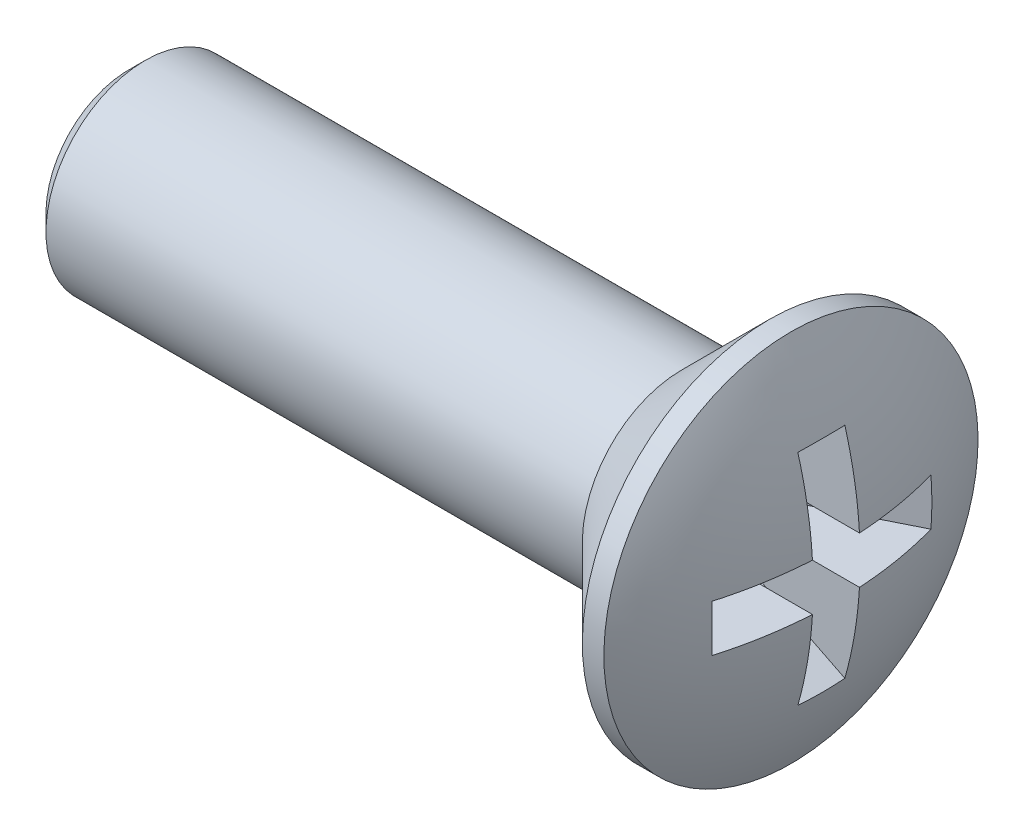
ISO-10303-21;
HEADER;
FILE_DESCRIPTION(('STEP AP214'),'2;1');
FILE_NAME('part.step','',(''),(''),'','','');
FILE_SCHEMA(('AUTOMOTIVE_DESIGN { 1 0 10303 214 1 1 1 1 }'));
ENDSEC;
DATA;
#1=APPLICATION_CONTEXT('core data for automotive mechanical design processes');
#2=APPLICATION_PROTOCOL_DEFINITION('international standard','automotive_design',2000,#1);
#3=PRODUCT_CONTEXT('',#1,'mechanical');
#4=PRODUCT('Part','Part','',(#3));
#5=PRODUCT_RELATED_PRODUCT_CATEGORY('part','',(#4));
#6=PRODUCT_DEFINITION_FORMATION('','',#4);
#7=PRODUCT_DEFINITION_CONTEXT('part definition',#1,'design');
#8=PRODUCT_DEFINITION('design','',#6,#7);
#9=PRODUCT_DEFINITION_SHAPE('','',#8);
#10=(LENGTH_UNIT() NAMED_UNIT(*) SI_UNIT(.MILLI.,.METRE.));
#11=(NAMED_UNIT(*) PLANE_ANGLE_UNIT() SI_UNIT($,.RADIAN.));
#12=(NAMED_UNIT(*) SI_UNIT($,.STERADIAN.) SOLID_ANGLE_UNIT());
#13=UNCERTAINTY_MEASURE_WITH_UNIT(LENGTH_MEASURE(1.E-05),#10,'distance_accuracy_value','');
#14=(GEOMETRIC_REPRESENTATION_CONTEXT(3) GLOBAL_UNCERTAINTY_ASSIGNED_CONTEXT((#13)) GLOBAL_UNIT_ASSIGNED_CONTEXT((#10,
#11,#12)) REPRESENTATION_CONTEXT('',''));
#15=CARTESIAN_POINT('',(0.,0.,0.));
#16=DIRECTION('',(0.,0.,1.));
#17=DIRECTION('',(1.,0.,0.));
#18=AXIS2_PLACEMENT_3D('',#15,#16,#17);
#19=CARTESIAN_POINT('',(-12.1008928571429,0.,0.));
#20=DIRECTION('',(1.,0.,0.));
#21=DIRECTION('',(0.,-1.,0.));
#22=AXIS2_PLACEMENT_3D('',#19,#20,#21);
#23=SPHERICAL_SURFACE('',#22,12.1008928571429);
#24=CARTESIAN_POINT('',(-1.4,0.,0.));
#25=DIRECTION('',(1.,0.,0.));
#26=DIRECTION('',(0.,1.,0.));
#27=AXIS2_PLACEMENT_3D('',#24,#25,#26);
#28=CIRCLE('',#27,5.65);
#29=CARTESIAN_POINT('',(-1.4,5.65,0.));
#30=VERTEX_POINT('',#29);
#31=EDGE_CURVE('E273',#30,#30,#28,.T.);
#32=ORIENTED_EDGE('',*,*,#31,.T.);
#33=EDGE_LOOP('',(#32));
#34=FACE_BOUND('',#33,.T.);
#35=CARTESIAN_POINT('',(-12.1008928571429,0.71,0.));
#36=DIRECTION('',(0.,-1.,0.));
#37=DIRECTION('',(0.,0.,-1.));
#38=AXIS2_PLACEMENT_3D('',#35,#36,#37);
#39=CIRCLE('',#38,12.0800458583588);
#40=CARTESIAN_POINT('',(-0.482948462369839,0.71,3.30921077902471));
#41=VERTEX_POINT('',#40);
#42=CARTESIAN_POINT('',(-0.0417300362812456,0.71,0.71));
#43=VERTEX_POINT('',#42);
#44=EDGE_CURVE('E200',#41,#43,#39,.F.);
#45=ORIENTED_EDGE('',*,*,#44,.T.);
#46=CARTESIAN_POINT('',(-12.1008928571429,0.,0.71));
#47=DIRECTION('',(0.,0.,-1.));
#48=DIRECTION('',(-1.,0.,0.));
#49=AXIS2_PLACEMENT_3D('',#46,#47,#48);
#50=CIRCLE('',#49,12.0800458583588);
#51=CARTESIAN_POINT('',(-0.482948462369839,3.30921077902471,0.71));
#52=VERTEX_POINT('',#51);
#53=EDGE_CURVE('E163',#43,#52,#50,.F.);
#54=ORIENTED_EDGE('',*,*,#53,.T.);
#55=CARTESIAN_POINT('',(-11.1092740163963,-1.98887970340109,0.));
#56=DIRECTION('',(0.44619781310981,-0.894934361602025,0.));
#57=DIRECTION('',(0.894934361602025,0.44619781310981,0.));
#58=AXIS2_PLACEMENT_3D('',#55,#56,#57);
#59=CIRCLE('',#58,11.8950686227582);
#60=CARTESIAN_POINT('',(-0.482948462369839,3.30921077902471,-0.71));
#61=VERTEX_POINT('',#60);
#62=EDGE_CURVE('E162',#52,#61,#59,.F.);
#63=ORIENTED_EDGE('',*,*,#62,.T.);
#64=CARTESIAN_POINT('',(-12.1008928571429,0.,-0.71));
#65=DIRECTION('',(0.,0.,-1.));
#66=DIRECTION('',(-1.,0.,0.));
#67=AXIS2_PLACEMENT_3D('',#64,#65,#66);
#68=CIRCLE('',#67,12.0800458583588);
#69=CARTESIAN_POINT('',(-0.0417300362812456,0.71,-0.71));
#70=VERTEX_POINT('',#69);
#71=EDGE_CURVE('E160',#70,#61,#68,.F.);
#72=ORIENTED_EDGE('',*,*,#71,.F.);
#73=CARTESIAN_POINT('',(-12.1008928571429,0.71,0.));
#74=DIRECTION('',(0.,-1.,0.));
#75=DIRECTION('',(0.,0.,-1.));
#76=AXIS2_PLACEMENT_3D('',#73,#74,#75);
#77=CIRCLE('',#76,12.0800458583588);
#78=CARTESIAN_POINT('',(-0.482948462369839,0.71,-3.30921077902471));
#79=VERTEX_POINT('',#78);
#80=EDGE_CURVE('E155',#70,#79,#77,.F.);
#81=ORIENTED_EDGE('',*,*,#80,.T.);
#82=CARTESIAN_POINT('',(-11.1092740163963,0.,1.98887970340109));
#83=DIRECTION('',(0.44619781310981,0.,0.894934361602025));
#84=DIRECTION('',(0.894934361602025,0.,-0.44619781310981));
#85=AXIS2_PLACEMENT_3D('',#82,#83,#84);
#86=CIRCLE('',#85,11.8950686227582);
#87=CARTESIAN_POINT('',(-0.482948462369839,-0.71,-3.30921077902471));
#88=VERTEX_POINT('',#87);
#89=EDGE_CURVE('E153',#79,#88,#86,.F.);
#90=ORIENTED_EDGE('',*,*,#89,.T.);
#91=CARTESIAN_POINT('',(-12.1008928571429,-0.71,0.));
#92=DIRECTION('',(0.,-1.,0.));
#93=DIRECTION('',(0.,0.,-1.));
#94=AXIS2_PLACEMENT_3D('',#91,#92,#93);
#95=CIRCLE('',#94,12.0800458583588);
#96=CARTESIAN_POINT('',(-0.0417300362812456,-0.71,-0.71));
#97=VERTEX_POINT('',#96);
#98=EDGE_CURVE('E138',#97,#88,#95,.F.);
#99=ORIENTED_EDGE('',*,*,#98,.F.);
#100=CARTESIAN_POINT('',(-12.1008928571429,0.,-0.71));
#101=DIRECTION('',(0.,0.,-1.));
#102=DIRECTION('',(-1.,0.,0.));
#103=AXIS2_PLACEMENT_3D('',#100,#101,#102);
#104=CIRCLE('',#103,12.0800458583588);
#105=CARTESIAN_POINT('',(-0.482948462369839,-3.30921077902471,-0.71));
#106=VERTEX_POINT('',#105);
#107=EDGE_CURVE('E128',#106,#97,#104,.F.);
#108=ORIENTED_EDGE('',*,*,#107,.F.);
#109=CARTESIAN_POINT('',(-11.1092740163963,1.98887970340109,0.));
#110=DIRECTION('',(0.44619781310981,0.894934361602025,0.));
#111=DIRECTION('',(-0.894934361602025,0.44619781310981,0.));
#112=AXIS2_PLACEMENT_3D('',#109,#110,#111);
#113=CIRCLE('',#112,11.8950686227582);
#114=CARTESIAN_POINT('',(-0.482948462369839,-3.30921077902471,0.71));
#115=VERTEX_POINT('',#114);
#116=EDGE_CURVE('E139',#115,#106,#113,.T.);
#117=ORIENTED_EDGE('',*,*,#116,.F.);
#118=CARTESIAN_POINT('',(-12.1008928571429,0.,0.71));
#119=DIRECTION('',(0.,0.,-1.));
#120=DIRECTION('',(-1.,0.,0.));
#121=AXIS2_PLACEMENT_3D('',#118,#119,#120);
#122=CIRCLE('',#121,12.0800458583588);
#123=CARTESIAN_POINT('',(-0.0417300362812456,-0.71,0.71));
#124=VERTEX_POINT('',#123);
#125=EDGE_CURVE('E167',#115,#124,#122,.F.);
#126=ORIENTED_EDGE('',*,*,#125,.T.);
#127=CARTESIAN_POINT('',(-12.1008928571429,-0.71,0.));
#128=DIRECTION('',(0.,-1.,0.));
#129=DIRECTION('',(0.,0.,-1.));
#130=AXIS2_PLACEMENT_3D('',#127,#128,#129);
#131=CIRCLE('',#130,12.0800458583588);
#132=CARTESIAN_POINT('',(-0.482948462369839,-0.71,3.30921077902471));
#133=VERTEX_POINT('',#132);
#134=EDGE_CURVE('E199',#133,#124,#131,.F.);
#135=ORIENTED_EDGE('',*,*,#134,.F.);
#136=CARTESIAN_POINT('',(-11.1092740163963,0.,-1.98887970340109));
#137=DIRECTION('',(0.44619781310981,0.,-0.894934361602025));
#138=DIRECTION('',(-0.894934361602025,0.,-0.44619781310981));
#139=AXIS2_PLACEMENT_3D('',#136,#137,#138);
#140=CIRCLE('',#139,11.8950686227582);
#141=EDGE_CURVE('E197',#41,#133,#140,.T.);
#142=ORIENTED_EDGE('',*,*,#141,.F.);
#143=EDGE_LOOP('',(#45,#54,#63,#72,#81,#90,#99,#108,#117,#126,#135,#142));
#144=FACE_BOUND('',#143,.T.);
#145=ADVANCED_FACE('F34',(#34,#144),#23,.T.);
#146=CARTESIAN_POINT('',(0.,0.,0.));
#147=DIRECTION('',(1.,0.,0.));
#148=DIRECTION('',(0.,1.,0.));
#149=AXIS2_PLACEMENT_3D('',#146,#147,#148);
#150=CYLINDRICAL_SURFACE('',#149,5.65);
#151=CARTESIAN_POINT('',(-2.04999999999997,0.,0.));
#152=DIRECTION('',(1.,0.,0.));
#153=DIRECTION('',(0.,1.,0.));
#154=AXIS2_PLACEMENT_3D('',#151,#152,#153);
#155=CIRCLE('',#154,5.65);
#156=CARTESIAN_POINT('',(-2.04999999999997,5.65,0.));
#157=VERTEX_POINT('',#156);
#158=EDGE_CURVE('E275',#157,#157,#155,.T.);
#159=ORIENTED_EDGE('',*,*,#158,.T.);
#160=EDGE_LOOP('',(#159));
#161=FACE_BOUND('',#160,.T.);
#162=ORIENTED_EDGE('',*,*,#31,.F.);
#163=EDGE_LOOP('',(#162));
#164=FACE_BOUND('',#163,.T.);
#165=ADVANCED_FACE('F226',(#161,#164),#150,.T.);
#166=CARTESIAN_POINT('',(-2.04999999999997,0.,0.));
#167=DIRECTION('',(1.,0.,0.));
#168=DIRECTION('',(0.,1.,0.));
#169=AXIS2_PLACEMENT_3D('',#166,#167,#168);
#170=CONICAL_SURFACE('',#169,5.65,0.785398163397443);
#171=CARTESIAN_POINT('',(-4.7,0.,0.));
#172=DIRECTION('',(1.,0.,0.));
#173=DIRECTION('',(0.,1.,0.));
#174=AXIS2_PLACEMENT_3D('',#171,#172,#173);
#175=CIRCLE('',#174,3.);
#176=CARTESIAN_POINT('',(-4.7,3.,0.));
#177=VERTEX_POINT('',#176);
#178=EDGE_CURVE('E180',#177,#177,#175,.T.);
#179=ORIENTED_EDGE('',*,*,#178,.T.);
#180=EDGE_LOOP('',(#179));
#181=FACE_BOUND('',#180,.T.);
#182=ORIENTED_EDGE('',*,*,#158,.F.);
#183=EDGE_LOOP('',(#182));
#184=FACE_BOUND('',#183,.T.);
#185=ADVANCED_FACE('F232',(#181,#184),#170,.T.);
#186=CARTESIAN_POINT('',(0.,0.,0.));
#187=DIRECTION('',(1.,0.,0.));
#188=DIRECTION('',(0.,1.,0.));
#189=AXIS2_PLACEMENT_3D('',#186,#187,#188);
#190=CYLINDRICAL_SURFACE('',#189,3.);
#191=CARTESIAN_POINT('',(-20.9,0.,0.));
#192=DIRECTION('',(-1.,0.,0.));
#193=DIRECTION('',(0.,-1.,0.));
#194=AXIS2_PLACEMENT_3D('',#191,#192,#193);
#195=CIRCLE('',#194,3.);
#196=CARTESIAN_POINT('',(-20.9,-3.,0.));
#197=VERTEX_POINT('',#196);
#198=EDGE_CURVE('E43',#197,#197,#195,.F.);
#199=ORIENTED_EDGE('',*,*,#198,.T.);
#200=EDGE_LOOP('',(#199));
#201=FACE_BOUND('',#200,.T.);
#202=ORIENTED_EDGE('',*,*,#178,.F.);
#203=EDGE_LOOP('',(#202));
#204=FACE_BOUND('',#203,.T.);
#205=ADVANCED_FACE('F212',(#201,#204),#190,.T.);
#206=CARTESIAN_POINT('',(-21.4,3.,0.));
#207=DIRECTION('',(-1.,0.,0.));
#208=DIRECTION('',(0.,-1.,0.));
#209=AXIS2_PLACEMENT_3D('',#206,#207,#208);
#210=PLANE('',#209);
#211=CARTESIAN_POINT('',(-21.4,0.,0.));
#212=DIRECTION('',(-1.,0.,0.));
#213=DIRECTION('',(0.,-1.,0.));
#214=AXIS2_PLACEMENT_3D('',#211,#212,#213);
#215=CIRCLE('',#214,2.50000000000001);
#216=CARTESIAN_POINT('',(-21.4,-2.50000000000001,0.));
#217=VERTEX_POINT('',#216);
#218=EDGE_CURVE('E11',#217,#217,#215,.T.);
#219=ORIENTED_EDGE('',*,*,#218,.T.);
#220=EDGE_LOOP('',(#219));
#221=FACE_BOUND('',#220,.T.);
#222=ADVANCED_FACE('F262',(#221),#210,.T.);
#223=CARTESIAN_POINT('',(-3.85,0.,0.71));
#224=DIRECTION('',(0.,0.,-1.));
#225=DIRECTION('',(-1.,0.,0.));
#226=AXIS2_PLACEMENT_3D('',#223,#224,#225);
#227=PLANE('',#226);
#228=DIRECTION('',(1.,0.,0.));
#229=VECTOR('',#228,1.);
#230=CARTESIAN_POINT('',(-3.85,0.71,0.71));
#231=LINE('',#230,#229);
#232=CARTESIAN_POINT('',(-3.85,0.71,0.71));
#233=VERTEX_POINT('',#232);
#234=EDGE_CURVE('E51',#233,#43,#231,.T.);
#235=ORIENTED_EDGE('',*,*,#234,.F.);
#236=DIRECTION('',(0.,1.,0.));
#237=VECTOR('',#236,1.);
#238=CARTESIAN_POINT('',(-3.85,0.,0.71));
#239=LINE('',#238,#237);
#240=CARTESIAN_POINT('',(-3.85,1.63046080899428,0.71));
#241=VERTEX_POINT('',#240);
#242=EDGE_CURVE('E269',#233,#241,#239,.T.);
#243=ORIENTED_EDGE('',*,*,#242,.T.);
#244=DIRECTION('',(0.894934361602025,0.44619781310981,0.));
#245=VECTOR('',#244,1.);
#246=CARTESIAN_POINT('',(0.,3.55,0.71));
#247=LINE('',#246,#245);
#248=EDGE_CURVE('E177',#241,#52,#247,.T.);
#249=ORIENTED_EDGE('',*,*,#248,.T.);
#250=ORIENTED_EDGE('',*,*,#53,.F.);
#251=EDGE_LOOP('',(#235,#243,#249,#250));
#252=FACE_BOUND('',#251,.T.);
#253=ADVANCED_FACE('F254',(#252),#227,.T.);
#254=CARTESIAN_POINT('',(0.,3.55,0.));
#255=DIRECTION('',(0.44619781310981,-0.894934361602025,0.));
#256=DIRECTION('',(0.894934361602025,0.44619781310981,0.));
#257=AXIS2_PLACEMENT_3D('',#254,#255,#256);
#258=PLANE('',#257);
#259=ORIENTED_EDGE('',*,*,#248,.F.);
#260=DIRECTION('',(0.,0.,-1.));
#261=VECTOR('',#260,1.);
#262=CARTESIAN_POINT('',(-3.85,1.63046080899428,0.));
#263=LINE('',#262,#261);
#264=CARTESIAN_POINT('',(-3.85,1.63046080899428,-0.71));
#265=VERTEX_POINT('',#264);
#266=EDGE_CURVE('E187',#241,#265,#263,.T.);
#267=ORIENTED_EDGE('',*,*,#266,.T.);
#268=DIRECTION('',(0.894934361602025,0.44619781310981,0.));
#269=VECTOR('',#268,1.);
#270=CARTESIAN_POINT('',(0.,3.55,-0.71));
#271=LINE('',#270,#269);
#272=EDGE_CURVE('E181',#265,#61,#271,.T.);
#273=ORIENTED_EDGE('',*,*,#272,.T.);
#274=ORIENTED_EDGE('',*,*,#62,.F.);
#275=EDGE_LOOP('',(#259,#267,#273,#274));
#276=FACE_BOUND('',#275,.T.);
#277=ADVANCED_FACE('F251',(#276),#258,.T.);
#278=CARTESIAN_POINT('',(-3.85,0.,-0.71));
#279=DIRECTION('',(0.,0.,-1.));
#280=DIRECTION('',(-1.,0.,0.));
#281=AXIS2_PLACEMENT_3D('',#278,#279,#280);
#282=PLANE('',#281);
#283=ORIENTED_EDGE('',*,*,#71,.T.);
#284=ORIENTED_EDGE('',*,*,#272,.F.);
#285=DIRECTION('',(0.,1.,0.));
#286=VECTOR('',#285,1.);
#287=CARTESIAN_POINT('',(-3.85,0.,-0.71));
#288=LINE('',#287,#286);
#289=CARTESIAN_POINT('',(-3.85,0.71,-0.71));
#290=VERTEX_POINT('',#289);
#291=EDGE_CURVE('E189',#290,#265,#288,.T.);
#292=ORIENTED_EDGE('',*,*,#291,.F.);
#293=DIRECTION('',(1.,0.,0.));
#294=VECTOR('',#293,1.);
#295=CARTESIAN_POINT('',(-3.85,0.71,-0.71));
#296=LINE('',#295,#294);
#297=EDGE_CURVE('E186',#290,#70,#296,.T.);
#298=ORIENTED_EDGE('',*,*,#297,.T.);
#299=EDGE_LOOP('',(#283,#284,#292,#298));
#300=FACE_BOUND('',#299,.T.);
#301=ADVANCED_FACE('F253',(#300),#282,.F.);
#302=CARTESIAN_POINT('',(-3.85,0.71,0.));
#303=DIRECTION('',(0.,-1.,0.));
#304=DIRECTION('',(0.,0.,-1.));
#305=AXIS2_PLACEMENT_3D('',#302,#303,#304);
#306=PLANE('',#305);
#307=ORIENTED_EDGE('',*,*,#297,.F.);
#308=DIRECTION('',(0.,0.,-1.));
#309=VECTOR('',#308,1.);
#310=CARTESIAN_POINT('',(-3.85,0.71,0.));
#311=LINE('',#310,#309);
#312=CARTESIAN_POINT('',(-3.85,0.71,-1.63046080899428));
#313=VERTEX_POINT('',#312);
#314=EDGE_CURVE('E196',#290,#313,#311,.T.);
#315=ORIENTED_EDGE('',*,*,#314,.T.);
#316=DIRECTION('',(0.894934361602025,0.,-0.44619781310981));
#317=VECTOR('',#316,1.);
#318=CARTESIAN_POINT('',(0.,0.71,-3.55));
#319=LINE('',#318,#317);
#320=EDGE_CURVE('E190',#313,#79,#319,.T.);
#321=ORIENTED_EDGE('',*,*,#320,.T.);
#322=ORIENTED_EDGE('',*,*,#80,.F.);
#323=EDGE_LOOP('',(#307,#315,#321,#322));
#324=FACE_BOUND('',#323,.T.);
#325=ADVANCED_FACE('F249',(#324),#306,.T.);
#326=CARTESIAN_POINT('',(0.,0.,-3.55));
#327=DIRECTION('',(0.44619781310981,0.,0.894934361602025));
#328=DIRECTION('',(0.894934361602025,0.,-0.44619781310981));
#329=AXIS2_PLACEMENT_3D('',#326,#327,#328);
#330=PLANE('',#329);
#331=ORIENTED_EDGE('',*,*,#320,.F.);
#332=DIRECTION('',(0.,-1.,0.));
#333=VECTOR('',#332,1.);
#334=CARTESIAN_POINT('',(-3.85,0.,-1.63046080899428));
#335=LINE('',#334,#333);
#336=CARTESIAN_POINT('',(-3.85,-0.71,-1.63046080899428));
#337=VERTEX_POINT('',#336);
#338=EDGE_CURVE('E194',#313,#337,#335,.T.);
#339=ORIENTED_EDGE('',*,*,#338,.T.);
#340=DIRECTION('',(0.894934361602025,0.,-0.44619781310981));
#341=VECTOR('',#340,1.);
#342=CARTESIAN_POINT('',(0.,-0.71,-3.55));
#343=LINE('',#342,#341);
#344=EDGE_CURVE('E148',#337,#88,#343,.T.);
#345=ORIENTED_EDGE('',*,*,#344,.T.);
#346=ORIENTED_EDGE('',*,*,#89,.F.);
#347=EDGE_LOOP('',(#331,#339,#345,#346));
#348=FACE_BOUND('',#347,.T.);
#349=ADVANCED_FACE('F247',(#348),#330,.T.);
#350=CARTESIAN_POINT('',(-3.85,-0.71,0.));
#351=DIRECTION('',(0.,-1.,0.));
#352=DIRECTION('',(0.,0.,-1.));
#353=AXIS2_PLACEMENT_3D('',#350,#351,#352);
#354=PLANE('',#353);
#355=ORIENTED_EDGE('',*,*,#98,.T.);
#356=ORIENTED_EDGE('',*,*,#344,.F.);
#357=DIRECTION('',(0.,0.,-1.));
#358=VECTOR('',#357,1.);
#359=CARTESIAN_POINT('',(-3.85,-0.71,0.));
#360=LINE('',#359,#358);
#361=CARTESIAN_POINT('',(-3.85,-0.71,-0.71));
#362=VERTEX_POINT('',#361);
#363=EDGE_CURVE('E146',#362,#337,#360,.T.);
#364=ORIENTED_EDGE('',*,*,#363,.F.);
#365=DIRECTION('',(1.,0.,0.));
#366=VECTOR('',#365,1.);
#367=CARTESIAN_POINT('',(-3.85,-0.71,-0.71));
#368=LINE('',#367,#366);
#369=EDGE_CURVE('E132',#362,#97,#368,.T.);
#370=ORIENTED_EDGE('',*,*,#369,.T.);
#371=EDGE_LOOP('',(#355,#356,#364,#370));
#372=FACE_BOUND('',#371,.T.);
#373=ADVANCED_FACE('F142',(#372),#354,.F.);
#374=CARTESIAN_POINT('',(-3.85,0.,-0.71));
#375=DIRECTION('',(0.,0.,-1.));
#376=DIRECTION('',(-1.,0.,0.));
#377=AXIS2_PLACEMENT_3D('',#374,#375,#376);
#378=PLANE('',#377);
#379=ORIENTED_EDGE('',*,*,#107,.T.);
#380=ORIENTED_EDGE('',*,*,#369,.F.);
#381=DIRECTION('',(0.,1.,0.));
#382=VECTOR('',#381,1.);
#383=CARTESIAN_POINT('',(-3.85,0.,-0.71));
#384=LINE('',#383,#382);
#385=CARTESIAN_POINT('',(-3.85,-1.63046080899428,-0.71));
#386=VERTEX_POINT('',#385);
#387=EDGE_CURVE('E175',#386,#362,#384,.T.);
#388=ORIENTED_EDGE('',*,*,#387,.F.);
#389=DIRECTION('',(-0.894934361602025,0.44619781310981,0.));
#390=VECTOR('',#389,1.);
#391=CARTESIAN_POINT('',(0.,-3.55,-0.71));
#392=LINE('',#391,#390);
#393=EDGE_CURVE('E134',#386,#106,#392,.F.);
#394=ORIENTED_EDGE('',*,*,#393,.T.);
#395=EDGE_LOOP('',(#379,#380,#388,#394));
#396=FACE_BOUND('',#395,.T.);
#397=ADVANCED_FACE('F130',(#396),#378,.F.);
#398=CARTESIAN_POINT('',(0.,-3.55,0.));
#399=DIRECTION('',(0.44619781310981,0.894934361602025,0.));
#400=DIRECTION('',(-0.894934361602025,0.44619781310981,0.));
#401=AXIS2_PLACEMENT_3D('',#398,#399,#400);
#402=PLANE('',#401);
#403=ORIENTED_EDGE('',*,*,#116,.T.);
#404=ORIENTED_EDGE('',*,*,#393,.F.);
#405=DIRECTION('',(0.,0.,1.));
#406=VECTOR('',#405,1.);
#407=CARTESIAN_POINT('',(-3.85,-1.63046080899428,0.));
#408=LINE('',#407,#406);
#409=CARTESIAN_POINT('',(-3.85,-1.63046080899428,0.71));
#410=VERTEX_POINT('',#409);
#411=EDGE_CURVE('E172',#410,#386,#408,.F.);
#412=ORIENTED_EDGE('',*,*,#411,.F.);
#413=DIRECTION('',(-0.894934361602025,0.44619781310981,0.));
#414=VECTOR('',#413,1.);
#415=CARTESIAN_POINT('',(0.,-3.55,0.71));
#416=LINE('',#415,#414);
#417=EDGE_CURVE('E168',#410,#115,#416,.F.);
#418=ORIENTED_EDGE('',*,*,#417,.T.);
#419=EDGE_LOOP('',(#403,#404,#412,#418));
#420=FACE_BOUND('',#419,.T.);
#421=ADVANCED_FACE('F238',(#420),#402,.T.);
#422=CARTESIAN_POINT('',(-3.85,0.,0.71));
#423=DIRECTION('',(0.,0.,-1.));
#424=DIRECTION('',(-1.,0.,0.));
#425=AXIS2_PLACEMENT_3D('',#422,#423,#424);
#426=PLANE('',#425);
#427=ORIENTED_EDGE('',*,*,#417,.F.);
#428=DIRECTION('',(0.,1.,0.));
#429=VECTOR('',#428,1.);
#430=CARTESIAN_POINT('',(-3.85,0.,0.71));
#431=LINE('',#430,#429);
#432=CARTESIAN_POINT('',(-3.85,-0.71,0.71));
#433=VERTEX_POINT('',#432);
#434=EDGE_CURVE('E115',#410,#433,#431,.T.);
#435=ORIENTED_EDGE('',*,*,#434,.T.);
#436=DIRECTION('',(1.,0.,0.));
#437=VECTOR('',#436,1.);
#438=CARTESIAN_POINT('',(-3.85,-0.71,0.71));
#439=LINE('',#438,#437);
#440=EDGE_CURVE('E171',#433,#124,#439,.T.);
#441=ORIENTED_EDGE('',*,*,#440,.T.);
#442=ORIENTED_EDGE('',*,*,#125,.F.);
#443=EDGE_LOOP('',(#427,#435,#441,#442));
#444=FACE_BOUND('',#443,.T.);
#445=ADVANCED_FACE('F241',(#444),#426,.T.);
#446=CARTESIAN_POINT('',(-3.85,-0.71,0.));
#447=DIRECTION('',(0.,-1.,0.));
#448=DIRECTION('',(0.,0.,-1.));
#449=AXIS2_PLACEMENT_3D('',#446,#447,#448);
#450=PLANE('',#449);
#451=ORIENTED_EDGE('',*,*,#134,.T.);
#452=ORIENTED_EDGE('',*,*,#440,.F.);
#453=DIRECTION('',(0.,0.,-1.));
#454=VECTOR('',#453,1.);
#455=CARTESIAN_POINT('',(-3.85,-0.71,0.));
#456=LINE('',#455,#454);
#457=CARTESIAN_POINT('',(-3.85,-0.71,1.63046080899428));
#458=VERTEX_POINT('',#457);
#459=EDGE_CURVE('E207',#458,#433,#456,.T.);
#460=ORIENTED_EDGE('',*,*,#459,.F.);
#461=DIRECTION('',(-0.894934361602025,0.,-0.44619781310981));
#462=VECTOR('',#461,1.);
#463=CARTESIAN_POINT('',(0.,-0.71,3.55));
#464=LINE('',#463,#462);
#465=EDGE_CURVE('E108',#458,#133,#464,.F.);
#466=ORIENTED_EDGE('',*,*,#465,.T.);
#467=EDGE_LOOP('',(#451,#452,#460,#466));
#468=FACE_BOUND('',#467,.T.);
#469=ADVANCED_FACE('F246',(#468),#450,.F.);
#470=CARTESIAN_POINT('',(0.,0.,3.55));
#471=DIRECTION('',(0.44619781310981,0.,-0.894934361602025));
#472=DIRECTION('',(-0.894934361602025,0.,-0.44619781310981));
#473=AXIS2_PLACEMENT_3D('',#470,#471,#472);
#474=PLANE('',#473);
#475=ORIENTED_EDGE('',*,*,#141,.T.);
#476=ORIENTED_EDGE('',*,*,#465,.F.);
#477=DIRECTION('',(0.,1.,0.));
#478=VECTOR('',#477,1.);
#479=CARTESIAN_POINT('',(-3.85,0.,1.63046080899428));
#480=LINE('',#479,#478);
#481=CARTESIAN_POINT('',(-3.85,0.71,1.63046080899428));
#482=VERTEX_POINT('',#481);
#483=EDGE_CURVE('E204',#482,#458,#480,.F.);
#484=ORIENTED_EDGE('',*,*,#483,.F.);
#485=DIRECTION('',(-0.894934361602025,0.,-0.44619781310981));
#486=VECTOR('',#485,1.);
#487=CARTESIAN_POINT('',(0.,0.71,3.55));
#488=LINE('',#487,#486);
#489=EDGE_CURVE('E201',#482,#41,#488,.F.);
#490=ORIENTED_EDGE('',*,*,#489,.T.);
#491=EDGE_LOOP('',(#475,#476,#484,#490));
#492=FACE_BOUND('',#491,.T.);
#493=ADVANCED_FACE('F243',(#492),#474,.T.);
#494=CARTESIAN_POINT('',(-3.85,0.71,0.));
#495=DIRECTION('',(0.,-1.,0.));
#496=DIRECTION('',(0.,0.,-1.));
#497=AXIS2_PLACEMENT_3D('',#494,#495,#496);
#498=PLANE('',#497);
#499=ORIENTED_EDGE('',*,*,#489,.F.);
#500=DIRECTION('',(0.,0.,-1.));
#501=VECTOR('',#500,1.);
#502=CARTESIAN_POINT('',(-3.85,0.71,0.));
#503=LINE('',#502,#501);
#504=EDGE_CURVE('E208',#482,#233,#503,.T.);
#505=ORIENTED_EDGE('',*,*,#504,.T.);
#506=ORIENTED_EDGE('',*,*,#234,.T.);
#507=ORIENTED_EDGE('',*,*,#44,.F.);
#508=EDGE_LOOP('',(#499,#505,#506,#507));
#509=FACE_BOUND('',#508,.T.);
#510=ADVANCED_FACE('F221',(#509),#498,.T.);
#511=CARTESIAN_POINT('',(-3.85,0.,0.));
#512=DIRECTION('',(1.,0.,0.));
#513=DIRECTION('',(0.,0.,-1.));
#514=AXIS2_PLACEMENT_3D('',#511,#512,#513);
#515=PLANE('',#514);
#516=ORIENTED_EDGE('',*,*,#242,.F.);
#517=ORIENTED_EDGE('',*,*,#504,.F.);
#518=ORIENTED_EDGE('',*,*,#483,.T.);
#519=ORIENTED_EDGE('',*,*,#459,.T.);
#520=ORIENTED_EDGE('',*,*,#434,.F.);
#521=ORIENTED_EDGE('',*,*,#411,.T.);
#522=ORIENTED_EDGE('',*,*,#387,.T.);
#523=ORIENTED_EDGE('',*,*,#363,.T.);
#524=ORIENTED_EDGE('',*,*,#338,.F.);
#525=ORIENTED_EDGE('',*,*,#314,.F.);
#526=ORIENTED_EDGE('',*,*,#291,.T.);
#527=ORIENTED_EDGE('',*,*,#266,.F.);
#528=EDGE_LOOP('',(#516,#517,#518,#519,#520,#521,#522,#523,#524,#525,#526,#527));
#529=FACE_BOUND('',#528,.T.);
#530=ADVANCED_FACE('F216',(#529),#515,.T.);
#531=CARTESIAN_POINT('',(-20.9,0.,0.));
#532=DIRECTION('',(1.,0.,0.));
#533=DIRECTION('',(0.,1.,0.));
#534=AXIS2_PLACEMENT_3D('',#531,#532,#533);
#535=CONICAL_SURFACE('',#534,3.,0.785398163397449);
#536=ORIENTED_EDGE('',*,*,#218,.F.);
#537=EDGE_LOOP('',(#536));
#538=FACE_BOUND('',#537,.T.);
#539=ORIENTED_EDGE('',*,*,#198,.F.);
#540=EDGE_LOOP('',(#539));
#541=FACE_BOUND('',#540,.T.);
#542=ADVANCED_FACE('F36',(#538,#541),#535,.T.);
#543=CLOSED_SHELL('',(#145,#165,#185,#205,#222,#253,#277,#301,#325,#349,#373,#397,#421,#445,
#469,#493,#510,#530,#542));
#544=MANIFOLD_SOLID_BREP('B2',#543);
#545=ADVANCED_BREP_SHAPE_REPRESENTATION('',(#18,#544),#14);
#546=SHAPE_DEFINITION_REPRESENTATION(#9,#545);
ENDSEC;
END-ISO-10303-21;
